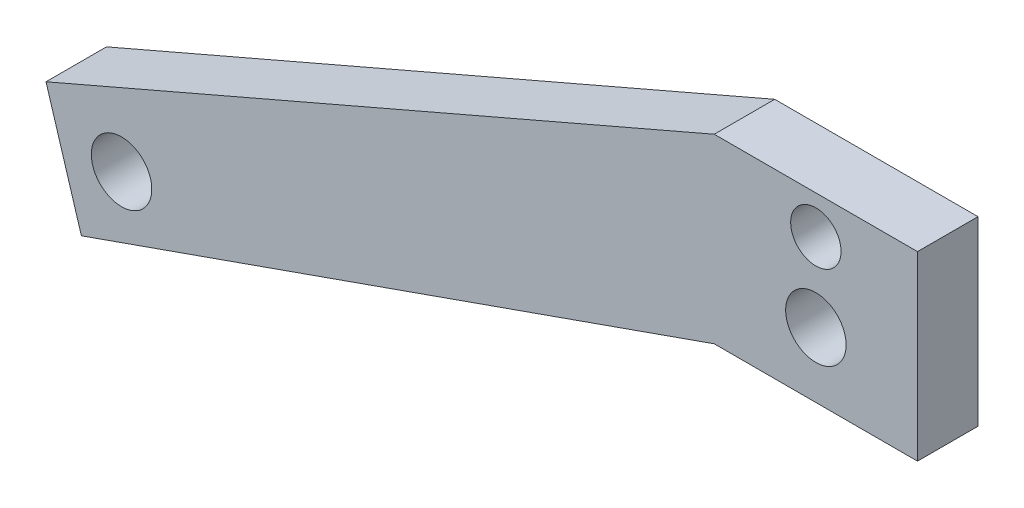
ISO-10303-21;
HEADER;
FILE_DESCRIPTION(('STEP AP214'),'2;1');
FILE_NAME('part.step','',(''),(''),'','','');
FILE_SCHEMA(('AUTOMOTIVE_DESIGN { 1 0 10303 214 1 1 1 1 }'));
ENDSEC;
DATA;
#1=APPLICATION_CONTEXT('core data for automotive mechanical design processes');
#2=APPLICATION_PROTOCOL_DEFINITION('international standard','automotive_design',2000,#1);
#3=PRODUCT_CONTEXT('',#1,'mechanical');
#4=PRODUCT('Part','Part','',(#3));
#5=PRODUCT_RELATED_PRODUCT_CATEGORY('part','',(#4));
#6=PRODUCT_DEFINITION_FORMATION('','',#4);
#7=PRODUCT_DEFINITION_CONTEXT('part definition',#1,'design');
#8=PRODUCT_DEFINITION('design','',#6,#7);
#9=PRODUCT_DEFINITION_SHAPE('','',#8);
#10=(LENGTH_UNIT() NAMED_UNIT(*) SI_UNIT(.MILLI.,.METRE.));
#11=(NAMED_UNIT(*) PLANE_ANGLE_UNIT() SI_UNIT($,.RADIAN.));
#12=(NAMED_UNIT(*) SI_UNIT($,.STERADIAN.) SOLID_ANGLE_UNIT());
#13=UNCERTAINTY_MEASURE_WITH_UNIT(LENGTH_MEASURE(1.E-05),#10,'distance_accuracy_value','');
#14=(GEOMETRIC_REPRESENTATION_CONTEXT(3) GLOBAL_UNCERTAINTY_ASSIGNED_CONTEXT((#13)) GLOBAL_UNIT_ASSIGNED_CONTEXT((#10,
#11,#12)) REPRESENTATION_CONTEXT('',''));
#15=CARTESIAN_POINT('',(0.,0.,0.));
#16=DIRECTION('',(0.,0.,1.));
#17=DIRECTION('',(1.,0.,0.));
#18=AXIS2_PLACEMENT_3D('',#15,#16,#17);
#19=CARTESIAN_POINT('',(-110.963863392355,-33.9250575722306,9.525));
#20=DIRECTION('',(-0.956304755963035,-0.292371704722739,0.));
#21=DIRECTION('',(0.292371704722739,-0.956304755963035,0.));
#22=AXIS2_PLACEMENT_3D('',#19,#20,#21);
#23=PLANE('',#22);
#24=DIRECTION('',(-0.292371704722739,0.956304755963035,0.));
#25=VECTOR('',#24,1.);
#26=CARTESIAN_POINT('',(-110.963863392355,-33.9250575722306,0.));
#27=LINE('',#26,#25);
#28=CARTESIAN_POINT('',(-115.62958968061,-18.6641545251605,0.));
#29=VERTEX_POINT('',#28);
#30=CARTESIAN_POINT('',(-121.199270655579,-0.44654892406467,0.));
#31=VERTEX_POINT('',#30);
#32=EDGE_CURVE('E145',#29,#31,#27,.T.);
#33=ORIENTED_EDGE('',*,*,#32,.F.);
#34=DIRECTION('',(0.,0.,-1.));
#35=VECTOR('',#34,1.);
#36=CARTESIAN_POINT('',(-115.62958968061,-18.6641545251605,9.525));
#37=LINE('',#36,#35);
#38=CARTESIAN_POINT('',(-115.62958968061,-18.6641545251605,9.525));
#39=VERTEX_POINT('',#38);
#40=EDGE_CURVE('E11',#39,#29,#37,.T.);
#41=ORIENTED_EDGE('',*,*,#40,.F.);
#42=DIRECTION('',(-0.292371704722739,0.956304755963035,0.));
#43=VECTOR('',#42,1.);
#44=CARTESIAN_POINT('',(-110.963863392355,-33.9250575722306,9.525));
#45=LINE('',#44,#43);
#46=CARTESIAN_POINT('',(-121.199270655579,-0.44654892406467,9.525));
#47=VERTEX_POINT('',#46);
#48=EDGE_CURVE('E279',#39,#47,#45,.T.);
#49=ORIENTED_EDGE('',*,*,#48,.T.);
#50=DIRECTION('',(0.,0.,-1.));
#51=VECTOR('',#50,1.);
#52=CARTESIAN_POINT('',(-121.199270655579,-0.44654892406467,9.525));
#53=LINE('',#52,#51);
#54=EDGE_CURVE('E88',#47,#31,#53,.T.);
#55=ORIENTED_EDGE('',*,*,#54,.T.);
#56=EDGE_LOOP('',(#33,#41,#49,#55));
#57=FACE_BOUND('',#56,.T.);
#58=ADVANCED_FACE('F42',(#57),#23,.T.);
#59=CARTESIAN_POINT('',(-6.91209033449553,19.625699628189,9.525));
#60=DIRECTION('',(0.332194931329718,-0.943210754603044,0.));
#61=DIRECTION('',(0.943210754603044,0.332194931329718,0.));
#62=AXIS2_PLACEMENT_3D('',#59,#60,#61);
#63=PLANE('',#62);
#64=DIRECTION('',(-0.943210754603044,-0.332194931329718,0.));
#65=VECTOR('',#64,1.);
#66=CARTESIAN_POINT('',(-6.91209033449553,19.625699628189,0.));
#67=LINE('',#66,#65);
#68=CARTESIAN_POINT('',(-15.9999937728734,16.4249775796861,0.));
#69=VERTEX_POINT('',#68);
#70=EDGE_CURVE('E142',#69,#29,#67,.T.);
#71=ORIENTED_EDGE('',*,*,#70,.F.);
#72=DIRECTION('',(0.,0.,-1.));
#73=VECTOR('',#72,1.);
#74=CARTESIAN_POINT('',(-15.9999937728734,16.4249775796861,9.525));
#75=LINE('',#74,#73);
#76=CARTESIAN_POINT('',(-15.9999937728734,16.4249775796861,9.525));
#77=VERTEX_POINT('',#76);
#78=EDGE_CURVE('E52',#77,#69,#75,.T.);
#79=ORIENTED_EDGE('',*,*,#78,.F.);
#80=DIRECTION('',(-0.943210754603044,-0.332194931329718,0.));
#81=VECTOR('',#80,1.);
#82=CARTESIAN_POINT('',(-6.91209033449553,19.625699628189,9.525));
#83=LINE('',#82,#81);
#84=EDGE_CURVE('E281',#77,#39,#83,.T.);
#85=ORIENTED_EDGE('',*,*,#84,.T.);
#86=ORIENTED_EDGE('',*,*,#40,.T.);
#87=EDGE_LOOP('',(#71,#79,#85,#86));
#88=FACE_BOUND('',#87,.T.);
#89=ADVANCED_FACE('F143',(#88),#63,.T.);
#90=CARTESIAN_POINT('',(0.,16.4249775796861,9.525));
#91=DIRECTION('',(0.,-1.,0.));
#92=DIRECTION('',(1.,0.,0.));
#93=AXIS2_PLACEMENT_3D('',#90,#91,#92);
#94=PLANE('',#93);
#95=DIRECTION('',(-1.,0.,0.));
#96=VECTOR('',#95,1.);
#97=CARTESIAN_POINT('',(0.,16.4249775796861,0.));
#98=LINE('',#97,#96);
#99=CARTESIAN_POINT('',(16.0000062271267,16.4249775796861,0.));
#100=VERTEX_POINT('',#99);
#101=EDGE_CURVE('E138',#100,#69,#98,.T.);
#102=ORIENTED_EDGE('',*,*,#101,.F.);
#103=DIRECTION('',(0.,0.,-1.));
#104=VECTOR('',#103,1.);
#105=CARTESIAN_POINT('',(16.0000062271267,16.4249775796861,9.525));
#106=LINE('',#105,#104);
#107=CARTESIAN_POINT('',(16.0000062271267,16.4249775796861,9.525));
#108=VERTEX_POINT('',#107);
#109=EDGE_CURVE('E125',#108,#100,#106,.T.);
#110=ORIENTED_EDGE('',*,*,#109,.F.);
#111=DIRECTION('',(-1.,0.,0.));
#112=VECTOR('',#111,1.);
#113=CARTESIAN_POINT('',(0.,16.4249775796861,9.525));
#114=LINE('',#113,#112);
#115=EDGE_CURVE('E117',#108,#77,#114,.T.);
#116=ORIENTED_EDGE('',*,*,#115,.T.);
#117=ORIENTED_EDGE('',*,*,#78,.T.);
#118=EDGE_LOOP('',(#102,#110,#116,#117));
#119=FACE_BOUND('',#118,.T.);
#120=ADVANCED_FACE('F136',(#119),#94,.T.);
#121=CARTESIAN_POINT('',(16.0000062271267,0.,9.525));
#122=DIRECTION('',(-1.,0.,0.));
#123=DIRECTION('',(0.,-1.,0.));
#124=AXIS2_PLACEMENT_3D('',#121,#122,#123);
#125=PLANE('',#124);
#126=DIRECTION('',(0.,1.,0.));
#127=VECTOR('',#126,1.);
#128=CARTESIAN_POINT('',(16.0000062271267,0.,0.));
#129=LINE('',#128,#127);
#130=CARTESIAN_POINT('',(16.0000062271267,44.9999775796863,0.));
#131=VERTEX_POINT('',#130);
#132=EDGE_CURVE('E123',#100,#131,#129,.T.);
#133=ORIENTED_EDGE('',*,*,#132,.T.);
#134=DIRECTION('',(0.,0.,-1.));
#135=VECTOR('',#134,1.);
#136=CARTESIAN_POINT('',(16.0000062271267,44.9999775796863,9.525));
#137=LINE('',#136,#135);
#138=CARTESIAN_POINT('',(16.0000062271267,44.9999775796863,9.525));
#139=VERTEX_POINT('',#138);
#140=EDGE_CURVE('E106',#139,#131,#137,.T.);
#141=ORIENTED_EDGE('',*,*,#140,.F.);
#142=DIRECTION('',(0.,1.,0.));
#143=VECTOR('',#142,1.);
#144=CARTESIAN_POINT('',(16.0000062271267,0.,9.525));
#145=LINE('',#144,#143);
#146=EDGE_CURVE('E110',#108,#139,#145,.T.);
#147=ORIENTED_EDGE('',*,*,#146,.F.);
#148=ORIENTED_EDGE('',*,*,#109,.T.);
#149=EDGE_LOOP('',(#133,#141,#147,#148));
#150=FACE_BOUND('',#149,.T.);
#151=ADVANCED_FACE('F121',(#150),#125,.F.);
#152=CARTESIAN_POINT('',(0.,44.9999775796863,9.525));
#153=DIRECTION('',(0.,-1.,0.));
#154=DIRECTION('',(0.,0.,-1.));
#155=AXIS2_PLACEMENT_3D('',#152,#153,#154);
#156=PLANE('',#155);
#157=DIRECTION('',(-1.,0.,0.));
#158=VECTOR('',#157,1.);
#159=CARTESIAN_POINT('',(0.,44.9999775796863,0.));
#160=LINE('',#159,#158);
#161=CARTESIAN_POINT('',(-15.9999937728733,44.9999775796863,0.));
#162=VERTEX_POINT('',#161);
#163=EDGE_CURVE('E151',#131,#162,#160,.T.);
#164=ORIENTED_EDGE('',*,*,#163,.T.);
#165=DIRECTION('',(0.,0.,-1.));
#166=VECTOR('',#165,1.);
#167=CARTESIAN_POINT('',(-15.9999937728733,44.9999775796863,9.525));
#168=LINE('',#167,#166);
#169=CARTESIAN_POINT('',(-15.9999937728733,44.9999775796863,9.525));
#170=VERTEX_POINT('',#169);
#171=EDGE_CURVE('E108',#170,#162,#168,.T.);
#172=ORIENTED_EDGE('',*,*,#171,.F.);
#173=DIRECTION('',(-1.,0.,0.));
#174=VECTOR('',#173,1.);
#175=CARTESIAN_POINT('',(0.,44.9999775796863,9.525));
#176=LINE('',#175,#174);
#177=EDGE_CURVE('E101',#139,#170,#176,.T.);
#178=ORIENTED_EDGE('',*,*,#177,.F.);
#179=ORIENTED_EDGE('',*,*,#140,.T.);
#180=EDGE_LOOP('',(#164,#172,#178,#179));
#181=FACE_BOUND('',#180,.T.);
#182=ADVANCED_FACE('F104',(#181),#156,.F.);
#183=CARTESIAN_POINT('',(6.22712671610374E-06,38.9999775796863,9.525));
#184=DIRECTION('',(0.,0.,-1.));
#185=DIRECTION('',(-1.,0.,0.));
#186=AXIS2_PLACEMENT_3D('',#183,#184,#185);
#187=CYLINDRICAL_SURFACE('',#186,3.96875);
#188=CARTESIAN_POINT('',(6.22712671610374E-06,38.9999775796863,9.525));
#189=DIRECTION('',(0.,0.,1.));
#190=DIRECTION('',(1.,0.,0.));
#191=AXIS2_PLACEMENT_3D('',#188,#189,#190);
#192=CIRCLE('',#191,3.96875);
#193=CARTESIAN_POINT('',(-3.96874377287329,38.9999775796863,9.525));
#194=VERTEX_POINT('',#193);
#195=EDGE_CURVE('E282',#194,#194,#192,.T.);
#196=CARTESIAN_POINT('',(6.22712671610374E-06,38.9999775796863,0.));
#197=DIRECTION('',(0.,0.,1.));
#198=DIRECTION('',(1.,0.,0.));
#199=AXIS2_PLACEMENT_3D('',#196,#197,#198);
#200=CIRCLE('',#199,3.96875);
#201=CARTESIAN_POINT('',(-3.96874377287329,38.9999775796863,0.));
#202=VERTEX_POINT('',#201);
#203=EDGE_CURVE('E171',#202,#202,#200,.T.);
#204=CARTESIAN_POINT('',(-3.96874377287329,38.9999775796863,9.525));
#205=CARTESIAN_POINT('',(-3.96874377287329,38.9999775796863,9.42578125));
#206=CARTESIAN_POINT('',(-3.96874377287329,38.9999775796863,9.3265625));
#207=CARTESIAN_POINT('',(-3.96874377287329,38.9999775796863,9.128125));
#208=CARTESIAN_POINT('',(-3.96874377287329,38.9999775796863,9.02890625));
#209=CARTESIAN_POINT('',(-3.96874377287329,38.9999775796863,8.83046875));
#210=CARTESIAN_POINT('',(-3.96874377287329,38.9999775796863,8.73125));
#211=CARTESIAN_POINT('',(-3.96874377287329,38.9999775796863,8.5328125));
#212=CARTESIAN_POINT('',(-3.96874377287329,38.9999775796863,8.43359375));
#213=CARTESIAN_POINT('',(-3.96874377287329,38.9999775796863,8.23515625));
#214=CARTESIAN_POINT('',(-3.96874377287329,38.9999775796863,8.1359375));
#215=CARTESIAN_POINT('',(-3.96874377287329,38.9999775796863,7.9375));
#216=CARTESIAN_POINT('',(-3.96874377287329,38.9999775796863,7.83828125));
#217=CARTESIAN_POINT('',(-3.96874377287329,38.9999775796863,7.63984375));
#218=CARTESIAN_POINT('',(-3.96874377287329,38.9999775796863,7.540625));
#219=CARTESIAN_POINT('',(-3.96874377287329,38.9999775796863,7.3421875));
#220=CARTESIAN_POINT('',(-3.96874377287329,38.9999775796863,7.24296875));
#221=CARTESIAN_POINT('',(-3.96874377287329,38.9999775796863,7.04453125));
#222=CARTESIAN_POINT('',(-3.96874377287329,38.9999775796863,6.9453125));
#223=CARTESIAN_POINT('',(-3.96874377287329,38.9999775796863,6.746875));
#224=CARTESIAN_POINT('',(-3.96874377287329,38.9999775796863,6.64765625));
#225=CARTESIAN_POINT('',(-3.96874377287329,38.9999775796863,6.44921875));
#226=CARTESIAN_POINT('',(-3.96874377287329,38.9999775796863,6.35));
#227=CARTESIAN_POINT('',(-3.96874377287329,38.9999775796863,6.1515625));
#228=CARTESIAN_POINT('',(-3.96874377287329,38.9999775796863,6.05234375));
#229=CARTESIAN_POINT('',(-3.96874377287329,38.9999775796863,5.85390625));
#230=CARTESIAN_POINT('',(-3.96874377287329,38.9999775796863,5.7546875));
#231=CARTESIAN_POINT('',(-3.96874377287329,38.9999775796863,5.55625));
#232=CARTESIAN_POINT('',(-3.96874377287329,38.9999775796863,5.45703125));
#233=CARTESIAN_POINT('',(-3.96874377287329,38.9999775796863,5.25859375));
#234=CARTESIAN_POINT('',(-3.96874377287329,38.9999775796863,5.159375));
#235=CARTESIAN_POINT('',(-3.96874377287329,38.9999775796863,4.9609375));
#236=CARTESIAN_POINT('',(-3.96874377287329,38.9999775796863,4.86171875));
#237=CARTESIAN_POINT('',(-3.96874377287329,38.9999775796863,4.66328125));
#238=CARTESIAN_POINT('',(-3.96874377287329,38.9999775796863,4.5640625));
#239=CARTESIAN_POINT('',(-3.96874377287329,38.9999775796863,4.365625));
#240=CARTESIAN_POINT('',(-3.96874377287329,38.9999775796863,4.26640625));
#241=CARTESIAN_POINT('',(-3.96874377287329,38.9999775796863,4.06796875));
#242=CARTESIAN_POINT('',(-3.96874377287329,38.9999775796863,3.96875));
#243=CARTESIAN_POINT('',(-3.96874377287329,38.9999775796863,3.7703125));
#244=CARTESIAN_POINT('',(-3.96874377287329,38.9999775796863,3.67109375));
#245=CARTESIAN_POINT('',(-3.96874377287329,38.9999775796863,3.47265625));
#246=CARTESIAN_POINT('',(-3.96874377287329,38.9999775796863,3.3734375));
#247=CARTESIAN_POINT('',(-3.96874377287329,38.9999775796863,3.175));
#248=CARTESIAN_POINT('',(-3.96874377287329,38.9999775796863,3.07578125));
#249=CARTESIAN_POINT('',(-3.96874377287329,38.9999775796863,2.87734375));
#250=CARTESIAN_POINT('',(-3.96874377287329,38.9999775796863,2.778125));
#251=CARTESIAN_POINT('',(-3.96874377287329,38.9999775796863,2.5796875));
#252=CARTESIAN_POINT('',(-3.96874377287329,38.9999775796863,2.48046875));
#253=CARTESIAN_POINT('',(-3.96874377287329,38.9999775796863,2.28203125));
#254=CARTESIAN_POINT('',(-3.96874377287329,38.9999775796863,2.1828125));
#255=CARTESIAN_POINT('',(-3.96874377287329,38.9999775796863,1.984375));
#256=CARTESIAN_POINT('',(-3.96874377287329,38.9999775796863,1.88515625));
#257=CARTESIAN_POINT('',(-3.96874377287329,38.9999775796863,1.68671875));
#258=CARTESIAN_POINT('',(-3.96874377287329,38.9999775796863,1.5875));
#259=CARTESIAN_POINT('',(-3.96874377287329,38.9999775796863,1.3890625));
#260=CARTESIAN_POINT('',(-3.96874377287329,38.9999775796863,1.28984375));
#261=CARTESIAN_POINT('',(-3.96874377287329,38.9999775796863,1.09140625));
#262=CARTESIAN_POINT('',(-3.96874377287329,38.9999775796863,0.992187500000001));
#263=CARTESIAN_POINT('',(-3.96874377287329,38.9999775796863,0.793750000000001));
#264=CARTESIAN_POINT('',(-3.96874377287329,38.9999775796863,0.69453125));
#265=CARTESIAN_POINT('',(-3.96874377287329,38.9999775796863,0.49609375));
#266=CARTESIAN_POINT('',(-3.96874377287329,38.9999775796863,0.396875));
#267=CARTESIAN_POINT('',(-3.96874377287329,38.9999775796863,0.1984375));
#268=CARTESIAN_POINT('',(-3.96874377287329,38.9999775796863,0.0992187500000001));
#269=CARTESIAN_POINT('',(-3.96874377287329,38.9999775796863,0.));
#270=B_SPLINE_CURVE_WITH_KNOTS('',3,(#204,#205,#206,#207,#208,#209,#210,#211,#212,#213,#214,
#215,#216,#217,#218,#219,#220,#221,#222,#223,#224,#225,#226,#227,#228,#229,#230,#231,#232,#233,
#234,#235,#236,#237,#238,#239,#240,#241,#242,#243,#244,#245,#246,#247,#248,#249,#250,#251,#252,
#253,#254,#255,#256,#257,#258,#259,#260,#261,#262,#263,#264,#265,#266,#267,#268,#269),
.UNSPECIFIED.,.F.,.F.,(4,2,2,2,2,2,2,2,2,2,2,2,2,2,2,2,2,2,2,2,2,2,2,2,2,2,2,2,2,2,2,2,4),(0.,
0.297656249999998,0.595312499999999,0.892968749999999,1.190625,1.48828125,1.7859375,2.08359375,
2.38125,2.67890625,2.9765625,3.27421875,3.571875,3.86953125,4.1671875,4.46484375,4.7625,
5.06015625,5.3578125,5.65546875,5.953125,6.25078125,6.5484375,6.84609375,7.14375,7.44140625,
7.7390625,8.03671875,8.334375,8.63203125,8.9296875,9.22734375,9.525),.UNSPECIFIED.);
#271=EDGE_CURVE('BSEAM183',#194,#202,#270,.T.);
#272=ORIENTED_EDGE('',*,*,#195,.T.);
#273=ORIENTED_EDGE('',*,*,#203,.F.);
#274=ORIENTED_EDGE('',*,*,#271,.T.);
#275=ORIENTED_EDGE('',*,*,#271,.F.);
#276=EDGE_LOOP('',(#272,#274,#273,#275));
#277=FACE_BOUND('',#276,.T.);
#278=ADVANCED_FACE('F183',(#277),#187,.F.);
#279=CARTESIAN_POINT('',(6.23902837032508E-06,26.6475746126805,9.525));
#280=DIRECTION('',(0.,0.,-1.));
#281=DIRECTION('',(-1.,0.,0.));
#282=AXIS2_PLACEMENT_3D('',#279,#280,#281);
#283=CYLINDRICAL_SURFACE('',#282,4.76250000164186);
#284=CARTESIAN_POINT('',(6.23902837032508E-06,26.6475746126805,9.525));
#285=DIRECTION('',(0.,0.,1.));
#286=DIRECTION('',(1.,0.,0.));
#287=AXIS2_PLACEMENT_3D('',#284,#285,#286);
#288=CIRCLE('',#287,4.76250000164186);
#289=CARTESIAN_POINT('',(-4.76249376261349,26.6475746126805,9.525));
#290=VERTEX_POINT('',#289);
#291=EDGE_CURVE('E197',#290,#290,#288,.T.);
#292=CARTESIAN_POINT('',(6.23902837032508E-06,26.6475746126805,0.));
#293=DIRECTION('',(0.,0.,1.));
#294=DIRECTION('',(1.,0.,0.));
#295=AXIS2_PLACEMENT_3D('',#292,#293,#294);
#296=CIRCLE('',#295,4.76250000164186);
#297=CARTESIAN_POINT('',(-4.76249376261349,26.6475746126805,0.));
#298=VERTEX_POINT('',#297);
#299=EDGE_CURVE('E167',#298,#298,#296,.T.);
#300=CARTESIAN_POINT('',(-4.76249376261349,26.6475746126805,9.525));
#301=CARTESIAN_POINT('',(-4.76249376261349,26.6475746126805,9.42578125));
#302=CARTESIAN_POINT('',(-4.76249376261349,26.6475746126805,9.3265625));
#303=CARTESIAN_POINT('',(-4.76249376261349,26.6475746126805,9.128125));
#304=CARTESIAN_POINT('',(-4.76249376261349,26.6475746126805,9.02890625));
#305=CARTESIAN_POINT('',(-4.76249376261349,26.6475746126805,8.83046875));
#306=CARTESIAN_POINT('',(-4.76249376261349,26.6475746126805,8.73125));
#307=CARTESIAN_POINT('',(-4.76249376261349,26.6475746126805,8.5328125));
#308=CARTESIAN_POINT('',(-4.76249376261349,26.6475746126805,8.43359375));
#309=CARTESIAN_POINT('',(-4.76249376261349,26.6475746126805,8.23515625));
#310=CARTESIAN_POINT('',(-4.76249376261349,26.6475746126805,8.1359375));
#311=CARTESIAN_POINT('',(-4.76249376261349,26.6475746126805,7.9375));
#312=CARTESIAN_POINT('',(-4.76249376261349,26.6475746126805,7.83828125));
#313=CARTESIAN_POINT('',(-4.76249376261349,26.6475746126805,7.63984375));
#314=CARTESIAN_POINT('',(-4.76249376261349,26.6475746126805,7.540625));
#315=CARTESIAN_POINT('',(-4.76249376261349,26.6475746126805,7.3421875));
#316=CARTESIAN_POINT('',(-4.76249376261349,26.6475746126805,7.24296875));
#317=CARTESIAN_POINT('',(-4.76249376261349,26.6475746126805,7.04453125));
#318=CARTESIAN_POINT('',(-4.76249376261349,26.6475746126805,6.9453125));
#319=CARTESIAN_POINT('',(-4.76249376261349,26.6475746126805,6.746875));
#320=CARTESIAN_POINT('',(-4.76249376261349,26.6475746126805,6.64765625));
#321=CARTESIAN_POINT('',(-4.76249376261349,26.6475746126805,6.44921875));
#322=CARTESIAN_POINT('',(-4.76249376261349,26.6475746126805,6.35));
#323=CARTESIAN_POINT('',(-4.76249376261349,26.6475746126805,6.1515625));
#324=CARTESIAN_POINT('',(-4.76249376261349,26.6475746126805,6.05234375));
#325=CARTESIAN_POINT('',(-4.76249376261349,26.6475746126805,5.85390625));
#326=CARTESIAN_POINT('',(-4.76249376261349,26.6475746126805,5.7546875));
#327=CARTESIAN_POINT('',(-4.76249376261349,26.6475746126805,5.55625));
#328=CARTESIAN_POINT('',(-4.76249376261349,26.6475746126805,5.45703125));
#329=CARTESIAN_POINT('',(-4.76249376261349,26.6475746126805,5.25859375));
#330=CARTESIAN_POINT('',(-4.76249376261349,26.6475746126805,5.159375));
#331=CARTESIAN_POINT('',(-4.76249376261349,26.6475746126805,4.9609375));
#332=CARTESIAN_POINT('',(-4.76249376261349,26.6475746126805,4.86171875));
#333=CARTESIAN_POINT('',(-4.76249376261349,26.6475746126805,4.66328125));
#334=CARTESIAN_POINT('',(-4.76249376261349,26.6475746126805,4.5640625));
#335=CARTESIAN_POINT('',(-4.76249376261349,26.6475746126805,4.365625));
#336=CARTESIAN_POINT('',(-4.76249376261349,26.6475746126805,4.26640625));
#337=CARTESIAN_POINT('',(-4.76249376261349,26.6475746126805,4.06796875));
#338=CARTESIAN_POINT('',(-4.76249376261349,26.6475746126805,3.96875));
#339=CARTESIAN_POINT('',(-4.76249376261349,26.6475746126805,3.7703125));
#340=CARTESIAN_POINT('',(-4.76249376261349,26.6475746126805,3.67109375));
#341=CARTESIAN_POINT('',(-4.76249376261349,26.6475746126805,3.47265625));
#342=CARTESIAN_POINT('',(-4.76249376261349,26.6475746126805,3.3734375));
#343=CARTESIAN_POINT('',(-4.76249376261349,26.6475746126805,3.175));
#344=CARTESIAN_POINT('',(-4.76249376261349,26.6475746126805,3.07578125));
#345=CARTESIAN_POINT('',(-4.76249376261349,26.6475746126805,2.87734375));
#346=CARTESIAN_POINT('',(-4.76249376261349,26.6475746126805,2.778125));
#347=CARTESIAN_POINT('',(-4.76249376261349,26.6475746126805,2.5796875));
#348=CARTESIAN_POINT('',(-4.76249376261349,26.6475746126805,2.48046875));
#349=CARTESIAN_POINT('',(-4.76249376261349,26.6475746126805,2.28203125));
#350=CARTESIAN_POINT('',(-4.76249376261349,26.6475746126805,2.1828125));
#351=CARTESIAN_POINT('',(-4.76249376261349,26.6475746126805,1.984375));
#352=CARTESIAN_POINT('',(-4.76249376261349,26.6475746126805,1.88515625));
#353=CARTESIAN_POINT('',(-4.76249376261349,26.6475746126805,1.68671875));
#354=CARTESIAN_POINT('',(-4.76249376261349,26.6475746126805,1.5875));
#355=CARTESIAN_POINT('',(-4.76249376261349,26.6475746126805,1.3890625));
#356=CARTESIAN_POINT('',(-4.76249376261349,26.6475746126805,1.28984375));
#357=CARTESIAN_POINT('',(-4.76249376261349,26.6475746126805,1.09140625));
#358=CARTESIAN_POINT('',(-4.76249376261349,26.6475746126805,0.992187500000001));
#359=CARTESIAN_POINT('',(-4.76249376261349,26.6475746126805,0.793750000000001));
#360=CARTESIAN_POINT('',(-4.76249376261349,26.6475746126805,0.69453125));
#361=CARTESIAN_POINT('',(-4.76249376261349,26.6475746126805,0.49609375));
#362=CARTESIAN_POINT('',(-4.76249376261349,26.6475746126805,0.396875));
#363=CARTESIAN_POINT('',(-4.76249376261349,26.6475746126805,0.1984375));
#364=CARTESIAN_POINT('',(-4.76249376261349,26.6475746126805,0.0992187500000001));
#365=CARTESIAN_POINT('',(-4.76249376261349,26.6475746126805,0.));
#366=B_SPLINE_CURVE_WITH_KNOTS('',3,(#300,#301,#302,#303,#304,#305,#306,#307,#308,#309,#310,
#311,#312,#313,#314,#315,#316,#317,#318,#319,#320,#321,#322,#323,#324,#325,#326,#327,#328,#329,
#330,#331,#332,#333,#334,#335,#336,#337,#338,#339,#340,#341,#342,#343,#344,#345,#346,#347,#348,
#349,#350,#351,#352,#353,#354,#355,#356,#357,#358,#359,#360,#361,#362,#363,#364,#365),
.UNSPECIFIED.,.F.,.F.,(4,2,2,2,2,2,2,2,2,2,2,2,2,2,2,2,2,2,2,2,2,2,2,2,2,2,2,2,2,2,2,2,4),(0.,
0.29765625,0.5953125,0.892968750000001,1.190625,1.48828125,1.7859375,2.08359375,2.38125,
2.67890625,2.9765625,3.27421875,3.571875,3.86953125,4.1671875,4.46484375,4.7625,5.06015625,
5.3578125,5.65546875,5.953125,6.25078125,6.5484375,6.84609375,7.14375,7.44140625,7.7390625,
8.03671875,8.334375,8.63203125,8.9296875,9.22734375,9.525),.UNSPECIFIED.);
#367=EDGE_CURVE('BSEAM185',#290,#298,#366,.T.);
#368=ORIENTED_EDGE('',*,*,#291,.T.);
#369=ORIENTED_EDGE('',*,*,#299,.F.);
#370=ORIENTED_EDGE('',*,*,#367,.T.);
#371=ORIENTED_EDGE('',*,*,#367,.F.);
#372=EDGE_LOOP('',(#368,#370,#369,#371));
#373=FACE_BOUND('',#372,.T.);
#374=ADVANCED_FACE('F185',(#373),#283,.F.);
#375=CARTESIAN_POINT('',(-109.305627367547,-6.77051123712846,9.525));
#376=DIRECTION('',(0.,0.,-1.));
#377=DIRECTION('',(-1.,0.,0.));
#378=AXIS2_PLACEMENT_3D('',#375,#376,#377);
#379=CYLINDRICAL_SURFACE('',#378,4.76250000164186);
#380=CARTESIAN_POINT('',(-109.305627367547,-6.77051123712846,9.525));
#381=DIRECTION('',(0.,0.,1.));
#382=DIRECTION('',(1.,0.,0.));
#383=AXIS2_PLACEMENT_3D('',#380,#381,#382);
#384=CIRCLE('',#383,4.76250000164186);
#385=CARTESIAN_POINT('',(-114.068127369188,-6.77051123712846,9.525));
#386=VERTEX_POINT('',#385);
#387=EDGE_CURVE('E158',#386,#386,#384,.T.);
#388=CARTESIAN_POINT('',(-109.305627367547,-6.77051123712846,0.));
#389=DIRECTION('',(0.,0.,1.));
#390=DIRECTION('',(1.,0.,0.));
#391=AXIS2_PLACEMENT_3D('',#388,#389,#390);
#392=CIRCLE('',#391,4.76250000164186);
#393=CARTESIAN_POINT('',(-114.068127369188,-6.77051123712846,0.));
#394=VERTEX_POINT('',#393);
#395=EDGE_CURVE('E163',#394,#394,#392,.T.);
#396=CARTESIAN_POINT('',(-114.068127369188,-6.77051123712846,9.525));
#397=CARTESIAN_POINT('',(-114.068127369188,-6.77051123712846,9.42578125));
#398=CARTESIAN_POINT('',(-114.068127369188,-6.77051123712846,9.3265625));
#399=CARTESIAN_POINT('',(-114.068127369188,-6.77051123712846,9.128125));
#400=CARTESIAN_POINT('',(-114.068127369188,-6.77051123712846,9.02890625));
#401=CARTESIAN_POINT('',(-114.068127369188,-6.77051123712846,8.83046875));
#402=CARTESIAN_POINT('',(-114.068127369188,-6.77051123712846,8.73125));
#403=CARTESIAN_POINT('',(-114.068127369188,-6.77051123712846,8.5328125));
#404=CARTESIAN_POINT('',(-114.068127369188,-6.77051123712846,8.43359375));
#405=CARTESIAN_POINT('',(-114.068127369188,-6.77051123712846,8.23515625));
#406=CARTESIAN_POINT('',(-114.068127369188,-6.77051123712846,8.1359375));
#407=CARTESIAN_POINT('',(-114.068127369188,-6.77051123712846,7.9375));
#408=CARTESIAN_POINT('',(-114.068127369188,-6.77051123712846,7.83828125));
#409=CARTESIAN_POINT('',(-114.068127369188,-6.77051123712846,7.63984375));
#410=CARTESIAN_POINT('',(-114.068127369188,-6.77051123712846,7.540625));
#411=CARTESIAN_POINT('',(-114.068127369188,-6.77051123712846,7.3421875));
#412=CARTESIAN_POINT('',(-114.068127369188,-6.77051123712846,7.24296875));
#413=CARTESIAN_POINT('',(-114.068127369188,-6.77051123712846,7.04453125));
#414=CARTESIAN_POINT('',(-114.068127369188,-6.77051123712846,6.9453125));
#415=CARTESIAN_POINT('',(-114.068127369188,-6.77051123712846,6.746875));
#416=CARTESIAN_POINT('',(-114.068127369188,-6.77051123712846,6.64765625));
#417=CARTESIAN_POINT('',(-114.068127369188,-6.77051123712846,6.44921875));
#418=CARTESIAN_POINT('',(-114.068127369188,-6.77051123712846,6.35));
#419=CARTESIAN_POINT('',(-114.068127369188,-6.77051123712846,6.1515625));
#420=CARTESIAN_POINT('',(-114.068127369188,-6.77051123712846,6.05234375));
#421=CARTESIAN_POINT('',(-114.068127369188,-6.77051123712846,5.85390625));
#422=CARTESIAN_POINT('',(-114.068127369188,-6.77051123712846,5.7546875));
#423=CARTESIAN_POINT('',(-114.068127369188,-6.77051123712846,5.55625));
#424=CARTESIAN_POINT('',(-114.068127369188,-6.77051123712846,5.45703125));
#425=CARTESIAN_POINT('',(-114.068127369188,-6.77051123712846,5.25859375));
#426=CARTESIAN_POINT('',(-114.068127369188,-6.77051123712846,5.159375));
#427=CARTESIAN_POINT('',(-114.068127369188,-6.77051123712846,4.9609375));
#428=CARTESIAN_POINT('',(-114.068127369188,-6.77051123712846,4.86171875));
#429=CARTESIAN_POINT('',(-114.068127369188,-6.77051123712846,4.66328125));
#430=CARTESIAN_POINT('',(-114.068127369188,-6.77051123712846,4.5640625));
#431=CARTESIAN_POINT('',(-114.068127369188,-6.77051123712846,4.365625));
#432=CARTESIAN_POINT('',(-114.068127369188,-6.77051123712846,4.26640625));
#433=CARTESIAN_POINT('',(-114.068127369188,-6.77051123712846,4.06796875));
#434=CARTESIAN_POINT('',(-114.068127369188,-6.77051123712846,3.96875));
#435=CARTESIAN_POINT('',(-114.068127369188,-6.77051123712846,3.7703125));
#436=CARTESIAN_POINT('',(-114.068127369188,-6.77051123712846,3.67109375));
#437=CARTESIAN_POINT('',(-114.068127369188,-6.77051123712846,3.47265625));
#438=CARTESIAN_POINT('',(-114.068127369188,-6.77051123712846,3.3734375));
#439=CARTESIAN_POINT('',(-114.068127369188,-6.77051123712846,3.175));
#440=CARTESIAN_POINT('',(-114.068127369188,-6.77051123712846,3.07578125));
#441=CARTESIAN_POINT('',(-114.068127369188,-6.77051123712846,2.87734375));
#442=CARTESIAN_POINT('',(-114.068127369188,-6.77051123712846,2.778125));
#443=CARTESIAN_POINT('',(-114.068127369188,-6.77051123712846,2.5796875));
#444=CARTESIAN_POINT('',(-114.068127369188,-6.77051123712846,2.48046875));
#445=CARTESIAN_POINT('',(-114.068127369188,-6.77051123712846,2.28203125));
#446=CARTESIAN_POINT('',(-114.068127369188,-6.77051123712846,2.1828125));
#447=CARTESIAN_POINT('',(-114.068127369188,-6.77051123712846,1.984375));
#448=CARTESIAN_POINT('',(-114.068127369188,-6.77051123712846,1.88515625));
#449=CARTESIAN_POINT('',(-114.068127369188,-6.77051123712846,1.68671875));
#450=CARTESIAN_POINT('',(-114.068127369188,-6.77051123712846,1.5875));
#451=CARTESIAN_POINT('',(-114.068127369188,-6.77051123712846,1.3890625));
#452=CARTESIAN_POINT('',(-114.068127369188,-6.77051123712846,1.28984375));
#453=CARTESIAN_POINT('',(-114.068127369188,-6.77051123712846,1.09140625));
#454=CARTESIAN_POINT('',(-114.068127369188,-6.77051123712846,0.992187500000001));
#455=CARTESIAN_POINT('',(-114.068127369188,-6.77051123712846,0.793750000000001));
#456=CARTESIAN_POINT('',(-114.068127369188,-6.77051123712846,0.69453125));
#457=CARTESIAN_POINT('',(-114.068127369188,-6.77051123712846,0.49609375));
#458=CARTESIAN_POINT('',(-114.068127369188,-6.77051123712846,0.396875));
#459=CARTESIAN_POINT('',(-114.068127369188,-6.77051123712846,0.1984375));
#460=CARTESIAN_POINT('',(-114.068127369188,-6.77051123712846,0.0992187500000001));
#461=CARTESIAN_POINT('',(-114.068127369188,-6.77051123712846,0.));
#462=B_SPLINE_CURVE_WITH_KNOTS('',3,(#396,#397,#398,#399,#400,#401,#402,#403,#404,#405,#406,
#407,#408,#409,#410,#411,#412,#413,#414,#415,#416,#417,#418,#419,#420,#421,#422,#423,#424,#425,
#426,#427,#428,#429,#430,#431,#432,#433,#434,#435,#436,#437,#438,#439,#440,#441,#442,#443,#444,
#445,#446,#447,#448,#449,#450,#451,#452,#453,#454,#455,#456,#457,#458,#459,#460,#461),
.UNSPECIFIED.,.F.,.F.,(4,2,2,2,2,2,2,2,2,2,2,2,2,2,2,2,2,2,2,2,2,2,2,2,2,2,2,2,2,2,2,2,4),(0.,
0.29765625,0.5953125,0.892968750000001,1.190625,1.48828125,1.7859375,2.08359375,2.38125,
2.67890625,2.9765625,3.27421875,3.571875,3.86953125,4.1671875,4.46484375,4.7625,5.06015625,
5.3578125,5.65546875,5.953125,6.25078125,6.5484375,6.84609375,7.14375,7.44140625,7.7390625,
8.03671875,8.334375,8.63203125,8.9296875,9.22734375,9.525),.UNSPECIFIED.);
#463=EDGE_CURVE('BSEAM44',#386,#394,#462,.T.);
#464=ORIENTED_EDGE('',*,*,#387,.T.);
#465=ORIENTED_EDGE('',*,*,#395,.F.);
#466=ORIENTED_EDGE('',*,*,#463,.T.);
#467=ORIENTED_EDGE('',*,*,#463,.F.);
#468=EDGE_LOOP('',(#464,#466,#465,#467));
#469=FACE_BOUND('',#468,.T.);
#470=ADVANCED_FACE('F44',(#469),#379,.F.);
#471=CARTESIAN_POINT('',(-18.8991209022775,43.7475425646517,9.525));
#472=DIRECTION('',(0.396579916842988,-0.918000201283643,0.));
#473=DIRECTION('',(0.918000201283643,0.396579916842988,0.));
#474=AXIS2_PLACEMENT_3D('',#471,#472,#473);
#475=PLANE('',#474);
#476=DIRECTION('',(-0.918000201283643,-0.396579916842988,0.));
#477=VECTOR('',#476,1.);
#478=CARTESIAN_POINT('',(-18.8991209022775,43.7475425646517,0.));
#479=LINE('',#478,#477);
#480=EDGE_CURVE('E81',#162,#31,#479,.T.);
#481=ORIENTED_EDGE('',*,*,#480,.T.);
#482=ORIENTED_EDGE('',*,*,#54,.F.);
#483=DIRECTION('',(-0.918000201283643,-0.396579916842988,0.));
#484=VECTOR('',#483,1.);
#485=CARTESIAN_POINT('',(-18.8991209022775,43.7475425646517,9.525));
#486=LINE('',#485,#484);
#487=EDGE_CURVE('E60',#170,#47,#486,.T.);
#488=ORIENTED_EDGE('',*,*,#487,.F.);
#489=ORIENTED_EDGE('',*,*,#171,.T.);
#490=EDGE_LOOP('',(#481,#482,#488,#489));
#491=FACE_BOUND('',#490,.T.);
#492=ADVANCED_FACE('F192',(#491),#475,.F.);
#493=CARTESIAN_POINT('',(0.,0.,9.525));
#494=DIRECTION('',(0.,0.,1.));
#495=DIRECTION('',(1.,0.,0.));
#496=AXIS2_PLACEMENT_3D('',#493,#494,#495);
#497=PLANE('',#496);
#498=ORIENTED_EDGE('',*,*,#387,.F.);
#499=EDGE_LOOP('',(#498));
#500=FACE_BOUND('',#499,.T.);
#501=ORIENTED_EDGE('',*,*,#291,.F.);
#502=EDGE_LOOP('',(#501));
#503=FACE_BOUND('',#502,.T.);
#504=ORIENTED_EDGE('',*,*,#195,.F.);
#505=EDGE_LOOP('',(#504));
#506=FACE_BOUND('',#505,.T.);
#507=ORIENTED_EDGE('',*,*,#48,.F.);
#508=ORIENTED_EDGE('',*,*,#84,.F.);
#509=ORIENTED_EDGE('',*,*,#115,.F.);
#510=ORIENTED_EDGE('',*,*,#146,.T.);
#511=ORIENTED_EDGE('',*,*,#177,.T.);
#512=ORIENTED_EDGE('',*,*,#487,.T.);
#513=EDGE_LOOP('',(#507,#508,#509,#510,#511,#512));
#514=FACE_BOUND('',#513,.T.);
#515=ADVANCED_FACE('F114',(#500,#503,#506,#514),#497,.T.);
#516=CARTESIAN_POINT('',(0.,0.,0.));
#517=DIRECTION('',(0.,0.,1.));
#518=DIRECTION('',(1.,0.,0.));
#519=AXIS2_PLACEMENT_3D('',#516,#517,#518);
#520=PLANE('',#519);
#521=ORIENTED_EDGE('',*,*,#395,.T.);
#522=EDGE_LOOP('',(#521));
#523=FACE_BOUND('',#522,.T.);
#524=ORIENTED_EDGE('',*,*,#299,.T.);
#525=EDGE_LOOP('',(#524));
#526=FACE_BOUND('',#525,.T.);
#527=ORIENTED_EDGE('',*,*,#203,.T.);
#528=EDGE_LOOP('',(#527));
#529=FACE_BOUND('',#528,.T.);
#530=ORIENTED_EDGE('',*,*,#32,.T.);
#531=ORIENTED_EDGE('',*,*,#480,.F.);
#532=ORIENTED_EDGE('',*,*,#163,.F.);
#533=ORIENTED_EDGE('',*,*,#132,.F.);
#534=ORIENTED_EDGE('',*,*,#101,.T.);
#535=ORIENTED_EDGE('',*,*,#70,.T.);
#536=EDGE_LOOP('',(#530,#531,#532,#533,#534,#535));
#537=FACE_BOUND('',#536,.T.);
#538=ADVANCED_FACE('F147',(#523,#526,#529,#537),#520,.F.);
#539=CLOSED_SHELL('',(#58,#89,#120,#151,#182,#278,#374,#470,#492,#515,#538));
#540=MANIFOLD_SOLID_BREP('B2',#539);
#541=ADVANCED_BREP_SHAPE_REPRESENTATION('',(#18,#540),#14);
#542=SHAPE_DEFINITION_REPRESENTATION(#9,#541);
ENDSEC;
END-ISO-10303-21;
